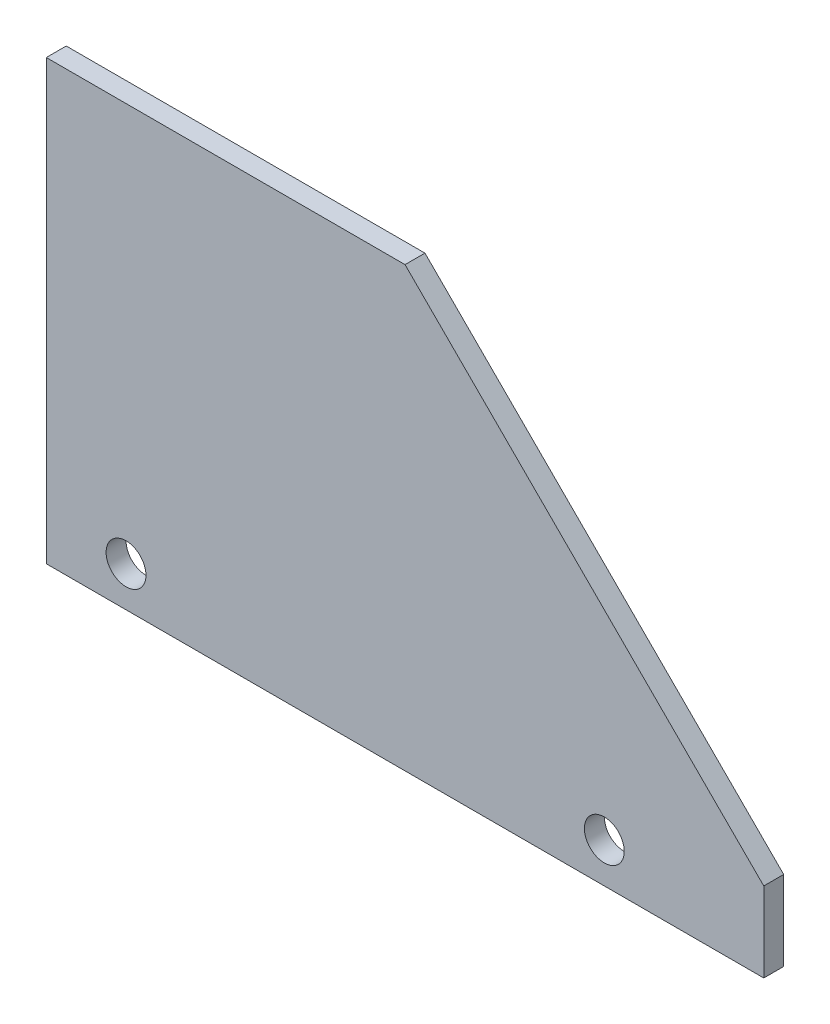
ISO-10303-21;
HEADER;
FILE_DESCRIPTION(('STEP AP214'),'2;1');
FILE_NAME('part.step','',(''),(''),'','','');
FILE_SCHEMA(('AUTOMOTIVE_DESIGN { 1 0 10303 214 1 1 1 1 }'));
ENDSEC;
DATA;
#1=APPLICATION_CONTEXT('core data for automotive mechanical design processes');
#2=APPLICATION_PROTOCOL_DEFINITION('international standard','automotive_design',2000,#1);
#3=PRODUCT_CONTEXT('',#1,'mechanical');
#4=PRODUCT('Part','Part','',(#3));
#5=PRODUCT_RELATED_PRODUCT_CATEGORY('part','',(#4));
#6=PRODUCT_DEFINITION_FORMATION('','',#4);
#7=PRODUCT_DEFINITION_CONTEXT('part definition',#1,'design');
#8=PRODUCT_DEFINITION('design','',#6,#7);
#9=PRODUCT_DEFINITION_SHAPE('','',#8);
#10=(LENGTH_UNIT() NAMED_UNIT(*) SI_UNIT(.MILLI.,.METRE.));
#11=(NAMED_UNIT(*) PLANE_ANGLE_UNIT() SI_UNIT($,.RADIAN.));
#12=(NAMED_UNIT(*) SI_UNIT($,.STERADIAN.) SOLID_ANGLE_UNIT());
#13=UNCERTAINTY_MEASURE_WITH_UNIT(LENGTH_MEASURE(1.E-05),#10,'distance_accuracy_value','');
#14=(GEOMETRIC_REPRESENTATION_CONTEXT(3) GLOBAL_UNCERTAINTY_ASSIGNED_CONTEXT((#13)) GLOBAL_UNIT_ASSIGNED_CONTEXT((#10,
#11,#12)) REPRESENTATION_CONTEXT('',''));
#15=CARTESIAN_POINT('',(0.,0.,0.));
#16=DIRECTION('',(0.,0.,1.));
#17=DIRECTION('',(1.,0.,0.));
#18=AXIS2_PLACEMENT_3D('',#15,#16,#17);
#19=CARTESIAN_POINT('',(63.5000000000002,0.,1.5875));
#20=DIRECTION('',(0.,1.,0.));
#21=DIRECTION('',(-1.,0.,0.));
#22=AXIS2_PLACEMENT_3D('',#19,#20,#21);
#23=PLANE('',#22);
#24=DIRECTION('',(1.,0.,0.));
#25=VECTOR('',#24,1.);
#26=CARTESIAN_POINT('',(63.5000000000002,0.,1.5875));
#27=LINE('',#26,#25);
#28=CARTESIAN_POINT('',(6.35,0.,1.5875));
#29=VERTEX_POINT('',#28);
#30=CARTESIAN_POINT('',(63.5000000000002,0.,1.5875));
#31=VERTEX_POINT('',#30);
#32=EDGE_CURVE('E79',#29,#31,#27,.T.);
#33=ORIENTED_EDGE('',*,*,#32,.F.);
#34=DIRECTION('',(0.,0.,1.));
#35=VECTOR('',#34,1.);
#36=CARTESIAN_POINT('',(6.35,0.,-0.9525));
#37=LINE('',#36,#35);
#38=CARTESIAN_POINT('',(6.35,0.,0.));
#39=VERTEX_POINT('',#38);
#40=EDGE_CURVE('E88',#39,#29,#37,.T.);
#41=ORIENTED_EDGE('',*,*,#40,.F.);
#42=DIRECTION('',(1.,0.,0.));
#43=VECTOR('',#42,1.);
#44=CARTESIAN_POINT('',(63.5000000000002,0.,0.));
#45=LINE('',#44,#43);
#46=CARTESIAN_POINT('',(63.5000000000002,0.,0.));
#47=VERTEX_POINT('',#46);
#48=EDGE_CURVE('E113',#39,#47,#45,.T.);
#49=ORIENTED_EDGE('',*,*,#48,.T.);
#50=DIRECTION('',(0.,0.,-1.));
#51=VECTOR('',#50,1.);
#52=CARTESIAN_POINT('',(63.5000000000002,0.,1.5875));
#53=LINE('',#52,#51);
#54=EDGE_CURVE('E42',#31,#47,#53,.T.);
#55=ORIENTED_EDGE('',*,*,#54,.F.);
#56=EDGE_LOOP('',(#33,#41,#49,#55));
#57=FACE_BOUND('',#56,.T.);
#58=ADVANCED_FACE('F35',(#57),#23,.F.);
#59=CARTESIAN_POINT('',(63.5000000000002,6.35000000000001,1.5875));
#60=DIRECTION('',(-1.,0.,0.));
#61=DIRECTION('',(0.,0.,1.));
#62=AXIS2_PLACEMENT_3D('',#59,#60,#61);
#63=PLANE('',#62);
#64=DIRECTION('',(0.,1.,0.));
#65=VECTOR('',#64,1.);
#66=CARTESIAN_POINT('',(63.5000000000002,6.35000000000001,0.));
#67=LINE('',#66,#65);
#68=CARTESIAN_POINT('',(63.5000000000002,6.35000000000001,0.));
#69=VERTEX_POINT('',#68);
#70=EDGE_CURVE('E115',#47,#69,#67,.T.);
#71=ORIENTED_EDGE('',*,*,#70,.T.);
#72=DIRECTION('',(0.,0.,-1.));
#73=VECTOR('',#72,1.);
#74=CARTESIAN_POINT('',(63.5000000000002,6.35000000000001,1.5875));
#75=LINE('',#74,#73);
#76=CARTESIAN_POINT('',(63.5000000000002,6.35000000000001,1.5875));
#77=VERTEX_POINT('',#76);
#78=EDGE_CURVE('E120',#77,#69,#75,.T.);
#79=ORIENTED_EDGE('',*,*,#78,.F.);
#80=DIRECTION('',(0.,1.,0.));
#81=VECTOR('',#80,1.);
#82=CARTESIAN_POINT('',(63.5000000000002,6.35000000000001,1.5875));
#83=LINE('',#82,#81);
#84=EDGE_CURVE('E100',#31,#77,#83,.T.);
#85=ORIENTED_EDGE('',*,*,#84,.F.);
#86=ORIENTED_EDGE('',*,*,#54,.T.);
#87=EDGE_LOOP('',(#71,#79,#85,#86));
#88=FACE_BOUND('',#87,.T.);
#89=ADVANCED_FACE('F143',(#88),#63,.F.);
#90=CARTESIAN_POINT('',(34.9249999999999,34.925,1.5875));
#91=DIRECTION('',(-0.707106781186545,-0.70710678118655,0.));
#92=DIRECTION('',(0.70710678118655,-0.707106781186545,0.));
#93=AXIS2_PLACEMENT_3D('',#90,#91,#92);
#94=PLANE('',#93);
#95=DIRECTION('',(-0.70710678118655,0.707106781186545,0.));
#96=VECTOR('',#95,1.);
#97=CARTESIAN_POINT('',(34.9249999999999,34.925,0.));
#98=LINE('',#97,#96);
#99=CARTESIAN_POINT('',(34.9249999999999,34.925,0.));
#100=VERTEX_POINT('',#99);
#101=EDGE_CURVE('E74',#69,#100,#98,.T.);
#102=ORIENTED_EDGE('',*,*,#101,.T.);
#103=DIRECTION('',(0.,0.,-1.));
#104=VECTOR('',#103,1.);
#105=CARTESIAN_POINT('',(34.9249999999999,34.925,1.5875));
#106=LINE('',#105,#104);
#107=CARTESIAN_POINT('',(34.9249999999999,34.925,1.5875));
#108=VERTEX_POINT('',#107);
#109=EDGE_CURVE('E112',#108,#100,#106,.T.);
#110=ORIENTED_EDGE('',*,*,#109,.F.);
#111=DIRECTION('',(-0.70710678118655,0.707106781186545,0.));
#112=VECTOR('',#111,1.);
#113=CARTESIAN_POINT('',(34.9249999999999,34.925,1.5875));
#114=LINE('',#113,#112);
#115=EDGE_CURVE('E57',#77,#108,#114,.T.);
#116=ORIENTED_EDGE('',*,*,#115,.F.);
#117=ORIENTED_EDGE('',*,*,#78,.T.);
#118=EDGE_LOOP('',(#102,#110,#116,#117));
#119=FACE_BOUND('',#118,.T.);
#120=ADVANCED_FACE('F144',(#119),#94,.F.);
#121=CARTESIAN_POINT('',(0.,34.925,1.5875));
#122=DIRECTION('',(0.,-1.,0.));
#123=DIRECTION('',(0.,0.,-1.));
#124=AXIS2_PLACEMENT_3D('',#121,#122,#123);
#125=PLANE('',#124);
#126=DIRECTION('',(-1.,0.,0.));
#127=VECTOR('',#126,1.);
#128=CARTESIAN_POINT('',(0.,34.925,0.));
#129=LINE('',#128,#127);
#130=CARTESIAN_POINT('',(6.35,34.925,0.));
#131=VERTEX_POINT('',#130);
#132=EDGE_CURVE('E101',#100,#131,#129,.T.);
#133=ORIENTED_EDGE('',*,*,#132,.T.);
#134=DIRECTION('',(0.,0.,1.));
#135=VECTOR('',#134,1.);
#136=CARTESIAN_POINT('',(6.35,34.925,-0.9525));
#137=LINE('',#136,#135);
#138=CARTESIAN_POINT('',(6.35,34.925,1.5875));
#139=VERTEX_POINT('',#138);
#140=EDGE_CURVE('E48',#131,#139,#137,.T.);
#141=ORIENTED_EDGE('',*,*,#140,.T.);
#142=DIRECTION('',(-1.,0.,0.));
#143=VECTOR('',#142,1.);
#144=CARTESIAN_POINT('',(0.,34.925,1.5875));
#145=LINE('',#144,#143);
#146=EDGE_CURVE('E96',#108,#139,#145,.T.);
#147=ORIENTED_EDGE('',*,*,#146,.F.);
#148=ORIENTED_EDGE('',*,*,#109,.T.);
#149=EDGE_LOOP('',(#133,#141,#147,#148));
#150=FACE_BOUND('',#149,.T.);
#151=ADVANCED_FACE('F135',(#150),#125,.F.);
#152=CARTESIAN_POINT('',(0.,0.,1.5875));
#153=DIRECTION('',(0.,0.,-1.));
#154=DIRECTION('',(-1.,0.,0.));
#155=AXIS2_PLACEMENT_3D('',#152,#153,#154);
#156=PLANE('',#155);
#157=CARTESIAN_POINT('',(50.8,3.17499999999999,1.5875));
#158=DIRECTION('',(0.,0.,1.));
#159=DIRECTION('',(1.,0.,0.));
#160=AXIS2_PLACEMENT_3D('',#157,#158,#159);
#161=CIRCLE('',#160,1.5875);
#162=CARTESIAN_POINT('',(52.3875,3.17499999999999,1.5875));
#163=VERTEX_POINT('',#162);
#164=EDGE_CURVE('E126',#163,#163,#161,.T.);
#165=ORIENTED_EDGE('',*,*,#164,.F.);
#166=EDGE_LOOP('',(#165));
#167=FACE_BOUND('',#166,.T.);
#168=CARTESIAN_POINT('',(12.7,3.175,1.5875));
#169=DIRECTION('',(0.,0.,1.));
#170=DIRECTION('',(1.,0.,0.));
#171=AXIS2_PLACEMENT_3D('',#168,#169,#170);
#172=CIRCLE('',#171,1.5875);
#173=CARTESIAN_POINT('',(14.2875,3.175,1.5875));
#174=VERTEX_POINT('',#173);
#175=EDGE_CURVE('E107',#174,#174,#172,.T.);
#176=ORIENTED_EDGE('',*,*,#175,.F.);
#177=EDGE_LOOP('',(#176));
#178=FACE_BOUND('',#177,.T.);
#179=ORIENTED_EDGE('',*,*,#146,.T.);
#180=DIRECTION('',(0.,1.,0.));
#181=VECTOR('',#180,1.);
#182=CARTESIAN_POINT('',(6.35,0.,1.5875));
#183=LINE('',#182,#181);
#184=EDGE_CURVE('E90',#29,#139,#183,.T.);
#185=ORIENTED_EDGE('',*,*,#184,.F.);
#186=ORIENTED_EDGE('',*,*,#32,.T.);
#187=ORIENTED_EDGE('',*,*,#84,.T.);
#188=ORIENTED_EDGE('',*,*,#115,.T.);
#189=EDGE_LOOP('',(#179,#185,#186,#187,#188));
#190=FACE_BOUND('',#189,.T.);
#191=ADVANCED_FACE('F94',(#167,#178,#190),#156,.F.);
#192=CARTESIAN_POINT('',(0.,0.,0.));
#193=DIRECTION('',(0.,0.,-1.));
#194=DIRECTION('',(-1.,0.,0.));
#195=AXIS2_PLACEMENT_3D('',#192,#193,#194);
#196=PLANE('',#195);
#197=DIRECTION('',(0.,-1.,0.));
#198=VECTOR('',#197,1.);
#199=CARTESIAN_POINT('',(6.35,0.,0.));
#200=LINE('',#199,#198);
#201=EDGE_CURVE('E11',#131,#39,#200,.T.);
#202=ORIENTED_EDGE('',*,*,#201,.F.);
#203=ORIENTED_EDGE('',*,*,#132,.F.);
#204=ORIENTED_EDGE('',*,*,#101,.F.);
#205=ORIENTED_EDGE('',*,*,#70,.F.);
#206=ORIENTED_EDGE('',*,*,#48,.F.);
#207=EDGE_LOOP('',(#202,#203,#204,#205,#206));
#208=FACE_BOUND('',#207,.T.);
#209=CARTESIAN_POINT('',(50.8,3.17499999999999,0.));
#210=DIRECTION('',(0.,0.,-1.));
#211=DIRECTION('',(-1.,0.,0.));
#212=AXIS2_PLACEMENT_3D('',#209,#210,#211);
#213=CIRCLE('',#212,1.5875);
#214=CARTESIAN_POINT('',(49.2125,3.17499999999999,0.));
#215=VERTEX_POINT('',#214);
#216=EDGE_CURVE('E124',#215,#215,#213,.T.);
#217=ORIENTED_EDGE('',*,*,#216,.F.);
#218=EDGE_LOOP('',(#217));
#219=FACE_BOUND('',#218,.T.);
#220=CARTESIAN_POINT('',(12.7,3.175,0.));
#221=DIRECTION('',(0.,0.,-1.));
#222=DIRECTION('',(-1.,0.,0.));
#223=AXIS2_PLACEMENT_3D('',#220,#221,#222);
#224=CIRCLE('',#223,1.5875);
#225=CARTESIAN_POINT('',(11.1125,3.175,0.));
#226=VERTEX_POINT('',#225);
#227=EDGE_CURVE('E116',#226,#226,#224,.T.);
#228=ORIENTED_EDGE('',*,*,#227,.F.);
#229=EDGE_LOOP('',(#228));
#230=FACE_BOUND('',#229,.T.);
#231=ADVANCED_FACE('F138',(#208,#219,#230),#196,.T.);
#232=CARTESIAN_POINT('',(12.7,3.175,-0.9525));
#233=DIRECTION('',(0.,0.,1.));
#234=DIRECTION('',(1.,0.,0.));
#235=AXIS2_PLACEMENT_3D('',#232,#233,#234);
#236=CYLINDRICAL_SURFACE('',#235,1.5875);
#237=ORIENTED_EDGE('',*,*,#227,.T.);
#238=EDGE_LOOP('',(#237));
#239=FACE_BOUND('',#238,.T.);
#240=ORIENTED_EDGE('',*,*,#175,.T.);
#241=EDGE_LOOP('',(#240));
#242=FACE_BOUND('',#241,.T.);
#243=ADVANCED_FACE('F171',(#239,#242),#236,.F.);
#244=CARTESIAN_POINT('',(50.8,3.17499999999999,-0.9525));
#245=DIRECTION('',(0.,0.,1.));
#246=DIRECTION('',(1.,0.,0.));
#247=AXIS2_PLACEMENT_3D('',#244,#245,#246);
#248=CYLINDRICAL_SURFACE('',#247,1.5875);
#249=ORIENTED_EDGE('',*,*,#216,.T.);
#250=EDGE_LOOP('',(#249));
#251=FACE_BOUND('',#250,.T.);
#252=ORIENTED_EDGE('',*,*,#164,.T.);
#253=EDGE_LOOP('',(#252));
#254=FACE_BOUND('',#253,.T.);
#255=ADVANCED_FACE('F175',(#251,#254),#248,.F.);
#256=CARTESIAN_POINT('',(6.35,0.,-0.9525));
#257=DIRECTION('',(1.,0.,0.));
#258=DIRECTION('',(0.,1.,0.));
#259=AXIS2_PLACEMENT_3D('',#256,#257,#258);
#260=PLANE('',#259);
#261=ORIENTED_EDGE('',*,*,#201,.T.);
#262=ORIENTED_EDGE('',*,*,#40,.T.);
#263=ORIENTED_EDGE('',*,*,#184,.T.);
#264=ORIENTED_EDGE('',*,*,#140,.F.);
#265=EDGE_LOOP('',(#261,#262,#263,#264));
#266=FACE_BOUND('',#265,.T.);
#267=ADVANCED_FACE('F89',(#266),#260,.F.);
#268=CLOSED_SHELL('',(#58,#89,#120,#151,#191,#231,#243,#255,#267));
#269=MANIFOLD_SOLID_BREP('B2',#268);
#270=ADVANCED_BREP_SHAPE_REPRESENTATION('',(#18,#269),#14);
#271=SHAPE_DEFINITION_REPRESENTATION(#9,#270);
ENDSEC;
END-ISO-10303-21;
